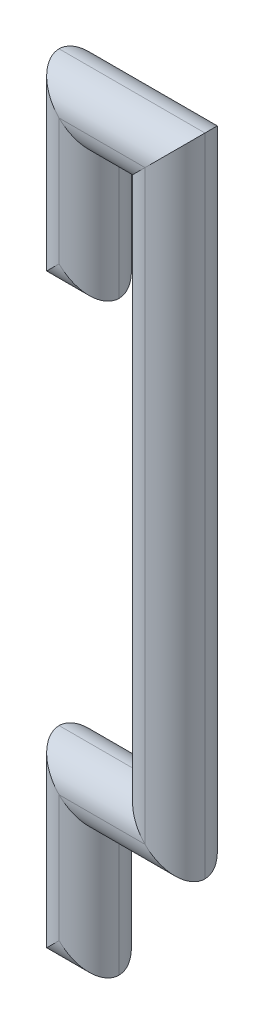
ISO-10303-21;
HEADER;
FILE_DESCRIPTION(('STEP AP214'),'2;1');
FILE_NAME('part.step','',(''),(''),'','','');
FILE_SCHEMA(('AUTOMOTIVE_DESIGN { 1 0 10303 214 1 1 1 1 }'));
ENDSEC;
DATA;
#1=APPLICATION_CONTEXT('core data for automotive mechanical design processes');
#2=APPLICATION_PROTOCOL_DEFINITION('international standard','automotive_design',2000,#1);
#3=PRODUCT_CONTEXT('',#1,'mechanical');
#4=PRODUCT('Part','Part','',(#3));
#5=PRODUCT_RELATED_PRODUCT_CATEGORY('part','',(#4));
#6=PRODUCT_DEFINITION_FORMATION('','',#4);
#7=PRODUCT_DEFINITION_CONTEXT('part definition',#1,'design');
#8=PRODUCT_DEFINITION('design','',#6,#7);
#9=PRODUCT_DEFINITION_SHAPE('','',#8);
#10=(LENGTH_UNIT() NAMED_UNIT(*) SI_UNIT(.MILLI.,.METRE.));
#11=(NAMED_UNIT(*) PLANE_ANGLE_UNIT() SI_UNIT($,.RADIAN.));
#12=(NAMED_UNIT(*) SI_UNIT($,.STERADIAN.) SOLID_ANGLE_UNIT());
#13=UNCERTAINTY_MEASURE_WITH_UNIT(LENGTH_MEASURE(1.E-05),#10,'distance_accuracy_value','');
#14=(GEOMETRIC_REPRESENTATION_CONTEXT(3) GLOBAL_UNCERTAINTY_ASSIGNED_CONTEXT((#13)) GLOBAL_UNIT_ASSIGNED_CONTEXT((#10,
#11,#12)) REPRESENTATION_CONTEXT('',''));
#15=CARTESIAN_POINT('',(0.,0.,0.));
#16=DIRECTION('',(0.,0.,1.));
#17=DIRECTION('',(1.,0.,0.));
#18=AXIS2_PLACEMENT_3D('',#15,#16,#17);
#19=CARTESIAN_POINT('',(-4.3,-9.7,0.));
#20=DIRECTION('',(-1.,0.,0.));
#21=DIRECTION('',(0.,-1.,0.));
#22=AXIS2_PLACEMENT_3D('',#19,#20,#21);
#23=CYLINDRICAL_SURFACE('',#22,2.3);
#24=CARTESIAN_POINT('',(-6.6,-9.7,0.));
#25=DIRECTION('',(-0.707106781186548,0.707106781186547,0.));
#26=DIRECTION('',(0.707106781186547,0.707106781186548,0.));
#27=AXIS2_PLACEMENT_3D('',#24,#25,#26);
#28=ELLIPSE('',#27,3.25269119345812,2.3);
#29=CARTESIAN_POINT('',(-8.9,-12.,0.));
#30=VERTEX_POINT('',#29);
#31=CARTESIAN_POINT('',(-6.6,-9.7,2.3));
#32=VERTEX_POINT('',#31);
#33=EDGE_CURVE('E11',#30,#32,#28,.T.);
#34=ORIENTED_EDGE('',*,*,#33,.F.);
#35=DIRECTION('',(-1.,0.,0.));
#36=VECTOR('',#35,1.);
#37=CARTESIAN_POINT('',(-4.3,-12.,0.));
#38=LINE('',#37,#36);
#39=CARTESIAN_POINT('',(-4.3,-12.,0.));
#40=VERTEX_POINT('',#39);
#41=EDGE_CURVE('E40',#40,#30,#38,.T.);
#42=ORIENTED_EDGE('',*,*,#41,.F.);
#43=CARTESIAN_POINT('',(-6.6,-9.7,0.));
#44=DIRECTION('',(-0.707106781186547,-0.707106781186548,0.));
#45=DIRECTION('',(-0.707106781186548,0.707106781186547,0.));
#46=AXIS2_PLACEMENT_3D('',#43,#44,#45);
#47=ELLIPSE('',#46,3.25269119345812,2.3);
#48=EDGE_CURVE('E250',#32,#40,#47,.F.);
#49=ORIENTED_EDGE('',*,*,#48,.F.);
#50=EDGE_LOOP('',(#34,#42,#49));
#51=FACE_BOUND('',#50,.T.);
#52=ADVANCED_FACE('F33',(#51),#23,.T.);
#53=CARTESIAN_POINT('',(-6.6,0.,0.));
#54=DIRECTION('',(0.,1.,0.));
#55=DIRECTION('',(-1.,0.,0.));
#56=AXIS2_PLACEMENT_3D('',#53,#54,#55);
#57=CYLINDRICAL_SURFACE('',#56,2.3);
#58=DIRECTION('',(0.,1.,0.));
#59=VECTOR('',#58,1.);
#60=CARTESIAN_POINT('',(-8.9,0.,0.));
#61=LINE('',#60,#59);
#62=CARTESIAN_POINT('',(-8.9,2.3,0.));
#63=VERTEX_POINT('',#62);
#64=EDGE_CURVE('E241',#30,#63,#61,.T.);
#65=ORIENTED_EDGE('',*,*,#64,.F.);
#66=ORIENTED_EDGE('',*,*,#33,.T.);
#67=DIRECTION('',(0.,1.,0.));
#68=VECTOR('',#67,1.);
#69=CARTESIAN_POINT('',(-6.6,0.,2.3));
#70=LINE('',#69,#68);
#71=CARTESIAN_POINT('',(-6.6,0.,2.3));
#72=VERTEX_POINT('',#71);
#73=EDGE_CURVE('E247',#72,#32,#70,.F.);
#74=ORIENTED_EDGE('',*,*,#73,.F.);
#75=CARTESIAN_POINT('',(-6.6,0.,0.));
#76=DIRECTION('',(0.707106781186547,0.707106781186548,0.));
#77=DIRECTION('',(0.707106781186548,-0.707106781186547,0.));
#78=AXIS2_PLACEMENT_3D('',#75,#76,#77);
#79=ELLIPSE('',#78,3.25269119345812,2.3);
#80=EDGE_CURVE('E244',#63,#72,#79,.T.);
#81=ORIENTED_EDGE('',*,*,#80,.F.);
#82=EDGE_LOOP('',(#65,#66,#74,#81));
#83=FACE_BOUND('',#82,.T.);
#84=ADVANCED_FACE('F256',(#83),#57,.T.);
#85=CARTESIAN_POINT('',(0.,-9.7,0.));
#86=DIRECTION('',(1.,0.,0.));
#87=DIRECTION('',(0.,1.,0.));
#88=AXIS2_PLACEMENT_3D('',#85,#86,#87);
#89=CYLINDRICAL_SURFACE('',#88,2.3);
#90=CARTESIAN_POINT('',(-6.6,-9.7,0.));
#91=DIRECTION('',(0.707106781186547,0.707106781186548,0.));
#92=DIRECTION('',(-0.707106781186548,0.707106781186547,0.));
#93=AXIS2_PLACEMENT_3D('',#90,#91,#92);
#94=ELLIPSE('',#93,3.25269119345812,2.3);
#95=CARTESIAN_POINT('',(-6.6,-9.7,-2.3));
#96=VERTEX_POINT('',#95);
#97=EDGE_CURVE('E233',#40,#96,#94,.T.);
#98=ORIENTED_EDGE('',*,*,#97,.F.);
#99=ORIENTED_EDGE('',*,*,#41,.T.);
#100=CARTESIAN_POINT('',(-6.6,-9.7,0.));
#101=DIRECTION('',(0.707106781186548,-0.707106781186547,0.));
#102=DIRECTION('',(0.707106781186547,0.707106781186548,0.));
#103=AXIS2_PLACEMENT_3D('',#100,#101,#102);
#104=ELLIPSE('',#103,3.25269119345812,2.3);
#105=EDGE_CURVE('E238',#96,#30,#104,.F.);
#106=ORIENTED_EDGE('',*,*,#105,.F.);
#107=EDGE_LOOP('',(#98,#99,#106));
#108=FACE_BOUND('',#107,.T.);
#109=ADVANCED_FACE('F254',(#108),#89,.T.);
#110=CARTESIAN_POINT('',(-6.6,0.,0.));
#111=DIRECTION('',(0.,-1.,0.));
#112=DIRECTION('',(1.,0.,0.));
#113=AXIS2_PLACEMENT_3D('',#110,#111,#112);
#114=CYLINDRICAL_SURFACE('',#113,2.3);
#115=ORIENTED_EDGE('',*,*,#73,.T.);
#116=ORIENTED_EDGE('',*,*,#48,.T.);
#117=DIRECTION('',(0.,1.,0.));
#118=VECTOR('',#117,1.);
#119=CARTESIAN_POINT('',(-4.3,-12.,0.));
#120=LINE('',#119,#118);
#121=CARTESIAN_POINT('',(-4.3,-2.3,0.));
#122=VERTEX_POINT('',#121);
#123=EDGE_CURVE('E230',#122,#40,#120,.F.);
#124=ORIENTED_EDGE('',*,*,#123,.F.);
#125=CARTESIAN_POINT('',(-6.6,0.,0.));
#126=DIRECTION('',(-0.707106781186547,-0.707106781186548,0.));
#127=DIRECTION('',(-0.707106781186548,0.707106781186547,0.));
#128=AXIS2_PLACEMENT_3D('',#125,#126,#127);
#129=ELLIPSE('',#128,3.25269119345812,2.3);
#130=EDGE_CURVE('E227',#72,#122,#129,.F.);
#131=ORIENTED_EDGE('',*,*,#130,.F.);
#132=EDGE_LOOP('',(#115,#116,#124,#131));
#133=FACE_BOUND('',#132,.T.);
#134=ADVANCED_FACE('F267',(#133),#114,.T.);
#135=CARTESIAN_POINT('',(0.,0.,0.));
#136=DIRECTION('',(1.,0.,0.));
#137=DIRECTION('',(0.,1.,0.));
#138=AXIS2_PLACEMENT_3D('',#135,#136,#137);
#139=CYLINDRICAL_SURFACE('',#138,2.3);
#140=DIRECTION('',(1.,0.,0.));
#141=VECTOR('',#140,1.);
#142=CARTESIAN_POINT('',(0.,2.3,0.));
#143=LINE('',#142,#141);
#144=CARTESIAN_POINT('',(2.3,2.3,0.));
#145=VERTEX_POINT('',#144);
#146=EDGE_CURVE('E218',#63,#145,#143,.T.);
#147=ORIENTED_EDGE('',*,*,#146,.F.);
#148=ORIENTED_EDGE('',*,*,#80,.T.);
#149=DIRECTION('',(1.,0.,0.));
#150=VECTOR('',#149,1.);
#151=CARTESIAN_POINT('',(0.,0.,2.3));
#152=LINE('',#151,#150);
#153=CARTESIAN_POINT('',(0.,0.,2.3));
#154=VERTEX_POINT('',#153);
#155=EDGE_CURVE('E224',#154,#72,#152,.F.);
#156=ORIENTED_EDGE('',*,*,#155,.F.);
#157=CARTESIAN_POINT('',(0.,0.,0.));
#158=DIRECTION('',(0.707106781186548,-0.707106781186547,0.));
#159=DIRECTION('',(-0.707106781186547,-0.707106781186548,0.));
#160=AXIS2_PLACEMENT_3D('',#157,#158,#159);
#161=ELLIPSE('',#160,3.25269119345812,2.3);
#162=EDGE_CURVE('E221',#145,#154,#161,.T.);
#163=ORIENTED_EDGE('',*,*,#162,.F.);
#164=EDGE_LOOP('',(#147,#148,#156,#163));
#165=FACE_BOUND('',#164,.T.);
#166=ADVANCED_FACE('F272',(#165),#139,.T.);
#167=CARTESIAN_POINT('',(-6.6,0.,0.));
#168=DIRECTION('',(0.,-1.,0.));
#169=DIRECTION('',(1.,0.,0.));
#170=AXIS2_PLACEMENT_3D('',#167,#168,#169);
#171=CYLINDRICAL_SURFACE('',#170,2.3);
#172=DIRECTION('',(0.,1.,0.));
#173=VECTOR('',#172,1.);
#174=CARTESIAN_POINT('',(-6.6,2.3,-2.3));
#175=LINE('',#174,#173);
#176=CARTESIAN_POINT('',(-6.6,0.,-2.3));
#177=VERTEX_POINT('',#176);
#178=EDGE_CURVE('E236',#96,#177,#175,.T.);
#179=ORIENTED_EDGE('',*,*,#178,.F.);
#180=ORIENTED_EDGE('',*,*,#105,.T.);
#181=ORIENTED_EDGE('',*,*,#64,.T.);
#182=CARTESIAN_POINT('',(-6.6,0.,0.));
#183=DIRECTION('',(-0.707106781186547,-0.707106781186548,0.));
#184=DIRECTION('',(0.707106781186548,-0.707106781186547,0.));
#185=AXIS2_PLACEMENT_3D('',#182,#183,#184);
#186=ELLIPSE('',#185,3.25269119345812,2.3);
#187=EDGE_CURVE('E215',#177,#63,#186,.F.);
#188=ORIENTED_EDGE('',*,*,#187,.F.);
#189=EDGE_LOOP('',(#179,#180,#181,#188));
#190=FACE_BOUND('',#189,.T.);
#191=ADVANCED_FACE('F260',(#190),#171,.T.);
#192=CARTESIAN_POINT('',(-6.6,0.,0.));
#193=DIRECTION('',(0.,1.,0.));
#194=DIRECTION('',(-1.,0.,0.));
#195=AXIS2_PLACEMENT_3D('',#192,#193,#194);
#196=CYLINDRICAL_SURFACE('',#195,2.3);
#197=ORIENTED_EDGE('',*,*,#97,.T.);
#198=ORIENTED_EDGE('',*,*,#178,.T.);
#199=CARTESIAN_POINT('',(-6.6,0.,0.));
#200=DIRECTION('',(0.707106781186547,0.707106781186548,0.));
#201=DIRECTION('',(-0.707106781186548,0.707106781186547,0.));
#202=AXIS2_PLACEMENT_3D('',#199,#200,#201);
#203=ELLIPSE('',#202,3.25269119345812,2.3);
#204=EDGE_CURVE('E210',#122,#177,#203,.T.);
#205=ORIENTED_EDGE('',*,*,#204,.F.);
#206=ORIENTED_EDGE('',*,*,#123,.T.);
#207=EDGE_LOOP('',(#197,#198,#205,#206));
#208=FACE_BOUND('',#207,.T.);
#209=ADVANCED_FACE('F264',(#208),#196,.T.);
#210=CARTESIAN_POINT('',(0.,0.,0.));
#211=DIRECTION('',(-1.,0.,0.));
#212=DIRECTION('',(0.,-1.,0.));
#213=AXIS2_PLACEMENT_3D('',#210,#211,#212);
#214=CYLINDRICAL_SURFACE('',#213,2.3);
#215=ORIENTED_EDGE('',*,*,#155,.T.);
#216=ORIENTED_EDGE('',*,*,#130,.T.);
#217=DIRECTION('',(1.,0.,0.));
#218=VECTOR('',#217,1.);
#219=CARTESIAN_POINT('',(-4.3,-2.3,0.));
#220=LINE('',#219,#218);
#221=CARTESIAN_POINT('',(-2.3,-2.3,0.));
#222=VERTEX_POINT('',#221);
#223=EDGE_CURVE('E207',#222,#122,#220,.F.);
#224=ORIENTED_EDGE('',*,*,#223,.F.);
#225=CARTESIAN_POINT('',(0.,0.,0.));
#226=DIRECTION('',(-0.707106781186548,0.707106781186547,0.));
#227=DIRECTION('',(0.707106781186547,0.707106781186548,0.));
#228=AXIS2_PLACEMENT_3D('',#225,#226,#227);
#229=ELLIPSE('',#228,3.25269119345812,2.3);
#230=EDGE_CURVE('E204',#154,#222,#229,.F.);
#231=ORIENTED_EDGE('',*,*,#230,.F.);
#232=EDGE_LOOP('',(#215,#216,#224,#231));
#233=FACE_BOUND('',#232,.T.);
#234=ADVANCED_FACE('F269',(#233),#214,.T.);
#235=CARTESIAN_POINT('',(0.,0.,0.));
#236=DIRECTION('',(0.,-1.,0.));
#237=DIRECTION('',(0.,0.,-1.));
#238=AXIS2_PLACEMENT_3D('',#235,#236,#237);
#239=CYLINDRICAL_SURFACE('',#238,2.3);
#240=DIRECTION('',(0.,-1.,0.));
#241=VECTOR('',#240,1.);
#242=CARTESIAN_POINT('',(2.3,0.,0.));
#243=LINE('',#242,#241);
#244=CARTESIAN_POINT('',(2.3,-47.3,0.));
#245=VERTEX_POINT('',#244);
#246=EDGE_CURVE('E195',#145,#245,#243,.T.);
#247=ORIENTED_EDGE('',*,*,#246,.F.);
#248=ORIENTED_EDGE('',*,*,#162,.T.);
#249=DIRECTION('',(0.,-1.,0.));
#250=VECTOR('',#249,1.);
#251=CARTESIAN_POINT('',(0.,0.,2.3));
#252=LINE('',#251,#250);
#253=CARTESIAN_POINT('',(0.,-45.,2.3));
#254=VERTEX_POINT('',#253);
#255=EDGE_CURVE('E201',#254,#154,#252,.F.);
#256=ORIENTED_EDGE('',*,*,#255,.F.);
#257=CARTESIAN_POINT('',(0.,-45.,0.));
#258=DIRECTION('',(-0.707106781186547,-0.707106781186547,0.));
#259=DIRECTION('',(-0.707106781186547,0.707106781186547,0.));
#260=AXIS2_PLACEMENT_3D('',#257,#258,#259);
#261=ELLIPSE('',#260,3.25269119345812,2.3);
#262=EDGE_CURVE('E198',#245,#254,#261,.T.);
#263=ORIENTED_EDGE('',*,*,#262,.F.);
#264=EDGE_LOOP('',(#247,#248,#256,#263));
#265=FACE_BOUND('',#264,.T.);
#266=ADVANCED_FACE('F275',(#265),#239,.T.);
#267=CARTESIAN_POINT('',(0.,0.,0.));
#268=DIRECTION('',(-1.,0.,0.));
#269=DIRECTION('',(0.,-1.,0.));
#270=AXIS2_PLACEMENT_3D('',#267,#268,#269);
#271=CYLINDRICAL_SURFACE('',#270,2.3);
#272=DIRECTION('',(1.,0.,0.));
#273=VECTOR('',#272,1.);
#274=CARTESIAN_POINT('',(2.3,0.,-2.3));
#275=LINE('',#274,#273);
#276=CARTESIAN_POINT('',(0.,0.,-2.3));
#277=VERTEX_POINT('',#276);
#278=EDGE_CURVE('E213',#177,#277,#275,.T.);
#279=ORIENTED_EDGE('',*,*,#278,.F.);
#280=ORIENTED_EDGE('',*,*,#187,.T.);
#281=ORIENTED_EDGE('',*,*,#146,.T.);
#282=CARTESIAN_POINT('',(0.,0.,0.));
#283=DIRECTION('',(-0.707106781186548,0.707106781186547,0.));
#284=DIRECTION('',(-0.707106781186547,-0.707106781186548,0.));
#285=AXIS2_PLACEMENT_3D('',#282,#283,#284);
#286=ELLIPSE('',#285,3.25269119345812,2.3);
#287=EDGE_CURVE('E192',#277,#145,#286,.F.);
#288=ORIENTED_EDGE('',*,*,#287,.F.);
#289=EDGE_LOOP('',(#279,#280,#281,#288));
#290=FACE_BOUND('',#289,.T.);
#291=ADVANCED_FACE('F283',(#290),#271,.T.);
#292=CARTESIAN_POINT('',(0.,0.,0.));
#293=DIRECTION('',(1.,0.,0.));
#294=DIRECTION('',(0.,1.,0.));
#295=AXIS2_PLACEMENT_3D('',#292,#293,#294);
#296=CYLINDRICAL_SURFACE('',#295,2.3);
#297=ORIENTED_EDGE('',*,*,#204,.T.);
#298=ORIENTED_EDGE('',*,*,#278,.T.);
#299=CARTESIAN_POINT('',(0.,0.,0.));
#300=DIRECTION('',(0.707106781186548,-0.707106781186547,0.));
#301=DIRECTION('',(0.707106781186547,0.707106781186548,0.));
#302=AXIS2_PLACEMENT_3D('',#299,#300,#301);
#303=ELLIPSE('',#302,3.25269119345812,2.3);
#304=EDGE_CURVE('E187',#222,#277,#303,.T.);
#305=ORIENTED_EDGE('',*,*,#304,.F.);
#306=ORIENTED_EDGE('',*,*,#223,.T.);
#307=EDGE_LOOP('',(#297,#298,#305,#306));
#308=FACE_BOUND('',#307,.T.);
#309=ADVANCED_FACE('F286',(#308),#296,.T.);
#310=CARTESIAN_POINT('',(0.,0.,0.));
#311=DIRECTION('',(0.,1.,0.));
#312=DIRECTION('',(0.,0.,1.));
#313=AXIS2_PLACEMENT_3D('',#310,#311,#312);
#314=CYLINDRICAL_SURFACE('',#313,2.3);
#315=ORIENTED_EDGE('',*,*,#255,.T.);
#316=ORIENTED_EDGE('',*,*,#230,.T.);
#317=DIRECTION('',(0.,-1.,0.));
#318=VECTOR('',#317,1.);
#319=CARTESIAN_POINT('',(-2.3,-2.3,0.));
#320=LINE('',#319,#318);
#321=CARTESIAN_POINT('',(-2.3,-42.7,0.));
#322=VERTEX_POINT('',#321);
#323=EDGE_CURVE('E184',#322,#222,#320,.F.);
#324=ORIENTED_EDGE('',*,*,#323,.F.);
#325=CARTESIAN_POINT('',(0.,-45.,0.));
#326=DIRECTION('',(0.707106781186547,0.707106781186547,0.));
#327=DIRECTION('',(0.707106781186547,-0.707106781186547,0.));
#328=AXIS2_PLACEMENT_3D('',#325,#326,#327);
#329=ELLIPSE('',#328,3.25269119345812,2.3);
#330=EDGE_CURVE('E181',#254,#322,#329,.F.);
#331=ORIENTED_EDGE('',*,*,#330,.F.);
#332=EDGE_LOOP('',(#315,#316,#324,#331));
#333=FACE_BOUND('',#332,.T.);
#334=ADVANCED_FACE('F292',(#333),#314,.T.);
#335=CARTESIAN_POINT('',(0.,-45.,0.));
#336=DIRECTION('',(-1.,0.,0.));
#337=DIRECTION('',(0.,0.,1.));
#338=AXIS2_PLACEMENT_3D('',#335,#336,#337);
#339=CYLINDRICAL_SURFACE('',#338,2.3);
#340=DIRECTION('',(-1.,0.,0.));
#341=VECTOR('',#340,1.);
#342=CARTESIAN_POINT('',(0.,-47.3,0.));
#343=LINE('',#342,#341);
#344=CARTESIAN_POINT('',(-4.29999999999999,-47.3,0.));
#345=VERTEX_POINT('',#344);
#346=EDGE_CURVE('E172',#245,#345,#343,.T.);
#347=ORIENTED_EDGE('',*,*,#346,.F.);
#348=ORIENTED_EDGE('',*,*,#262,.T.);
#349=DIRECTION('',(-1.,0.,0.));
#350=VECTOR('',#349,1.);
#351=CARTESIAN_POINT('',(0.,-45.,2.3));
#352=LINE('',#351,#350);
#353=CARTESIAN_POINT('',(-6.59999999999999,-45.,2.3));
#354=VERTEX_POINT('',#353);
#355=EDGE_CURVE('E178',#354,#254,#352,.F.);
#356=ORIENTED_EDGE('',*,*,#355,.F.);
#357=CARTESIAN_POINT('',(-6.59999999999999,-45.,0.));
#358=DIRECTION('',(-0.707106781186547,-0.707106781186547,0.));
#359=DIRECTION('',(-0.707106781186547,0.707106781186547,0.));
#360=AXIS2_PLACEMENT_3D('',#357,#358,#359);
#361=ELLIPSE('',#360,3.25269119345812,2.3);
#362=EDGE_CURVE('E175',#345,#354,#361,.T.);
#363=ORIENTED_EDGE('',*,*,#362,.F.);
#364=EDGE_LOOP('',(#347,#348,#356,#363));
#365=FACE_BOUND('',#364,.T.);
#366=ADVANCED_FACE('F297',(#365),#339,.T.);
#367=CARTESIAN_POINT('',(0.,0.,0.));
#368=DIRECTION('',(0.,1.,0.));
#369=DIRECTION('',(0.,0.,1.));
#370=AXIS2_PLACEMENT_3D('',#367,#368,#369);
#371=CYLINDRICAL_SURFACE('',#370,2.3);
#372=DIRECTION('',(0.,-1.,0.));
#373=VECTOR('',#372,1.);
#374=CARTESIAN_POINT('',(0.,-47.3,-2.3));
#375=LINE('',#374,#373);
#376=CARTESIAN_POINT('',(0.,-45.,-2.3));
#377=VERTEX_POINT('',#376);
#378=EDGE_CURVE('E190',#277,#377,#375,.T.);
#379=ORIENTED_EDGE('',*,*,#378,.F.);
#380=ORIENTED_EDGE('',*,*,#287,.T.);
#381=ORIENTED_EDGE('',*,*,#246,.T.);
#382=CARTESIAN_POINT('',(0.,-45.,0.));
#383=DIRECTION('',(0.707106781186547,0.707106781186547,0.));
#384=DIRECTION('',(-0.707106781186547,0.707106781186547,0.));
#385=AXIS2_PLACEMENT_3D('',#382,#383,#384);
#386=ELLIPSE('',#385,3.25269119345812,2.3);
#387=EDGE_CURVE('E169',#377,#245,#386,.F.);
#388=ORIENTED_EDGE('',*,*,#387,.F.);
#389=EDGE_LOOP('',(#379,#380,#381,#388));
#390=FACE_BOUND('',#389,.T.);
#391=ADVANCED_FACE('F281',(#390),#371,.T.);
#392=CARTESIAN_POINT('',(0.,0.,0.));
#393=DIRECTION('',(0.,-1.,0.));
#394=DIRECTION('',(0.,0.,-1.));
#395=AXIS2_PLACEMENT_3D('',#392,#393,#394);
#396=CYLINDRICAL_SURFACE('',#395,2.3);
#397=ORIENTED_EDGE('',*,*,#304,.T.);
#398=ORIENTED_EDGE('',*,*,#378,.T.);
#399=CARTESIAN_POINT('',(0.,-45.,0.));
#400=DIRECTION('',(-0.707106781186547,-0.707106781186547,0.));
#401=DIRECTION('',(0.707106781186547,-0.707106781186547,0.));
#402=AXIS2_PLACEMENT_3D('',#399,#400,#401);
#403=ELLIPSE('',#402,3.25269119345812,2.3);
#404=EDGE_CURVE('E164',#322,#377,#403,.T.);
#405=ORIENTED_EDGE('',*,*,#404,.F.);
#406=ORIENTED_EDGE('',*,*,#323,.T.);
#407=EDGE_LOOP('',(#397,#398,#405,#406));
#408=FACE_BOUND('',#407,.T.);
#409=ADVANCED_FACE('F289',(#408),#396,.T.);
#410=CARTESIAN_POINT('',(0.,-45.,0.));
#411=DIRECTION('',(1.,0.,0.));
#412=DIRECTION('',(0.,0.,-1.));
#413=AXIS2_PLACEMENT_3D('',#410,#411,#412);
#414=CYLINDRICAL_SURFACE('',#413,2.3);
#415=ORIENTED_EDGE('',*,*,#355,.T.);
#416=ORIENTED_EDGE('',*,*,#330,.T.);
#417=DIRECTION('',(-1.,0.,0.));
#418=VECTOR('',#417,1.);
#419=CARTESIAN_POINT('',(-2.3,-42.7,0.));
#420=LINE('',#419,#418);
#421=CARTESIAN_POINT('',(-8.89999999999999,-42.7,0.));
#422=VERTEX_POINT('',#421);
#423=EDGE_CURVE('E161',#422,#322,#420,.F.);
#424=ORIENTED_EDGE('',*,*,#423,.F.);
#425=CARTESIAN_POINT('',(-6.59999999999999,-45.,0.));
#426=DIRECTION('',(0.707106781186547,0.707106781186547,0.));
#427=DIRECTION('',(-0.707106781186547,0.707106781186547,0.));
#428=AXIS2_PLACEMENT_3D('',#425,#426,#427);
#429=ELLIPSE('',#428,3.25269119345812,2.3);
#430=EDGE_CURVE('E158',#354,#422,#429,.F.);
#431=ORIENTED_EDGE('',*,*,#430,.F.);
#432=EDGE_LOOP('',(#415,#416,#424,#431));
#433=FACE_BOUND('',#432,.T.);
#434=ADVANCED_FACE('F294',(#433),#414,.T.);
#435=CARTESIAN_POINT('',(-6.59999999999999,-45.,0.));
#436=DIRECTION('',(0.,-1.,0.));
#437=DIRECTION('',(0.,0.,-1.));
#438=AXIS2_PLACEMENT_3D('',#435,#436,#437);
#439=CYLINDRICAL_SURFACE('',#438,2.3);
#440=DIRECTION('',(0.,-1.,0.));
#441=VECTOR('',#440,1.);
#442=CARTESIAN_POINT('',(-4.29999999999999,-45.,0.));
#443=LINE('',#442,#441);
#444=CARTESIAN_POINT('',(-4.29999999999999,-57.,0.));
#445=VERTEX_POINT('',#444);
#446=EDGE_CURVE('E135',#345,#445,#443,.T.);
#447=ORIENTED_EDGE('',*,*,#446,.F.);
#448=ORIENTED_EDGE('',*,*,#362,.T.);
#449=DIRECTION('',(0.,-1.,0.));
#450=VECTOR('',#449,1.);
#451=CARTESIAN_POINT('',(-6.59999999999999,0.,2.3));
#452=LINE('',#451,#450);
#453=CARTESIAN_POINT('',(-6.59999999999999,-54.7,2.3));
#454=VERTEX_POINT('',#453);
#455=EDGE_CURVE('E155',#454,#354,#452,.F.);
#456=ORIENTED_EDGE('',*,*,#455,.F.);
#457=CARTESIAN_POINT('',(-6.59999999999999,-54.7,0.));
#458=DIRECTION('',(-0.707106781186547,-0.707106781186547,0.));
#459=DIRECTION('',(-0.707106781186547,0.707106781186547,0.));
#460=AXIS2_PLACEMENT_3D('',#457,#458,#459);
#461=ELLIPSE('',#460,3.25269119345812,2.3);
#462=EDGE_CURVE('E150',#445,#454,#461,.T.);
#463=ORIENTED_EDGE('',*,*,#462,.F.);
#464=EDGE_LOOP('',(#447,#448,#456,#463));
#465=FACE_BOUND('',#464,.T.);
#466=ADVANCED_FACE('F299',(#465),#439,.T.);
#467=CARTESIAN_POINT('',(0.,-45.,0.));
#468=DIRECTION('',(1.,0.,0.));
#469=DIRECTION('',(0.,0.,-1.));
#470=AXIS2_PLACEMENT_3D('',#467,#468,#469);
#471=CYLINDRICAL_SURFACE('',#470,2.3);
#472=DIRECTION('',(-1.,0.,0.));
#473=VECTOR('',#472,1.);
#474=CARTESIAN_POINT('',(-4.29999999999999,-45.,-2.3));
#475=LINE('',#474,#473);
#476=CARTESIAN_POINT('',(-6.59999999999999,-45.,-2.3));
#477=VERTEX_POINT('',#476);
#478=EDGE_CURVE('E167',#377,#477,#475,.T.);
#479=ORIENTED_EDGE('',*,*,#478,.F.);
#480=ORIENTED_EDGE('',*,*,#387,.T.);
#481=ORIENTED_EDGE('',*,*,#346,.T.);
#482=CARTESIAN_POINT('',(-6.59999999999999,-45.,0.));
#483=DIRECTION('',(0.707106781186547,0.707106781186547,0.));
#484=DIRECTION('',(-0.707106781186547,0.707106781186547,0.));
#485=AXIS2_PLACEMENT_3D('',#482,#483,#484);
#486=ELLIPSE('',#485,3.25269119345812,2.3);
#487=EDGE_CURVE('E128',#477,#345,#486,.F.);
#488=ORIENTED_EDGE('',*,*,#487,.F.);
#489=EDGE_LOOP('',(#479,#480,#481,#488));
#490=FACE_BOUND('',#489,.T.);
#491=ADVANCED_FACE('F304',(#490),#471,.T.);
#492=CARTESIAN_POINT('',(0.,-45.,0.));
#493=DIRECTION('',(-1.,0.,0.));
#494=DIRECTION('',(0.,0.,1.));
#495=AXIS2_PLACEMENT_3D('',#492,#493,#494);
#496=CYLINDRICAL_SURFACE('',#495,2.3);
#497=ORIENTED_EDGE('',*,*,#404,.T.);
#498=ORIENTED_EDGE('',*,*,#478,.T.);
#499=CARTESIAN_POINT('',(-6.59999999999999,-45.,0.));
#500=DIRECTION('',(-0.707106781186547,-0.707106781186547,0.));
#501=DIRECTION('',(0.707106781186547,-0.707106781186547,0.));
#502=AXIS2_PLACEMENT_3D('',#499,#500,#501);
#503=ELLIPSE('',#502,3.25269119345812,2.3);
#504=EDGE_CURVE('E125',#422,#477,#503,.T.);
#505=ORIENTED_EDGE('',*,*,#504,.F.);
#506=ORIENTED_EDGE('',*,*,#423,.T.);
#507=EDGE_LOOP('',(#497,#498,#505,#506));
#508=FACE_BOUND('',#507,.T.);
#509=ADVANCED_FACE('F306',(#508),#496,.T.);
#510=CARTESIAN_POINT('',(-6.59999999999999,0.,0.));
#511=DIRECTION('',(0.,1.,0.));
#512=DIRECTION('',(0.,0.,1.));
#513=AXIS2_PLACEMENT_3D('',#510,#511,#512);
#514=CYLINDRICAL_SURFACE('',#513,2.3);
#515=CARTESIAN_POINT('',(-6.59999999999999,-54.7,0.));
#516=DIRECTION('',(-0.707106781186547,0.707106781186547,0.));
#517=DIRECTION('',(0.707106781186547,0.707106781186547,0.));
#518=AXIS2_PLACEMENT_3D('',#515,#516,#517);
#519=ELLIPSE('',#518,3.25269119345812,2.3);
#520=CARTESIAN_POINT('',(-8.89999999999999,-57.,0.));
#521=VERTEX_POINT('',#520);
#522=EDGE_CURVE('E153',#454,#521,#519,.F.);
#523=ORIENTED_EDGE('',*,*,#522,.F.);
#524=ORIENTED_EDGE('',*,*,#455,.T.);
#525=ORIENTED_EDGE('',*,*,#430,.T.);
#526=DIRECTION('',(0.,-1.,0.));
#527=VECTOR('',#526,1.);
#528=CARTESIAN_POINT('',(-8.89999999999999,-42.7,0.));
#529=LINE('',#528,#527);
#530=EDGE_CURVE('E145',#521,#422,#529,.F.);
#531=ORIENTED_EDGE('',*,*,#530,.F.);
#532=EDGE_LOOP('',(#523,#524,#525,#531));
#533=FACE_BOUND('',#532,.T.);
#534=ADVANCED_FACE('F309',(#533),#514,.T.);
#535=CARTESIAN_POINT('',(-4.29999999999999,-54.7,0.));
#536=DIRECTION('',(-1.,0.,0.));
#537=DIRECTION('',(0.,0.,1.));
#538=AXIS2_PLACEMENT_3D('',#535,#536,#537);
#539=CYLINDRICAL_SURFACE('',#538,2.3);
#540=ORIENTED_EDGE('',*,*,#462,.T.);
#541=ORIENTED_EDGE('',*,*,#522,.T.);
#542=DIRECTION('',(-1.,0.,0.));
#543=VECTOR('',#542,1.);
#544=CARTESIAN_POINT('',(-4.29999999999999,-57.,0.));
#545=LINE('',#544,#543);
#546=EDGE_CURVE('E139',#445,#521,#545,.T.);
#547=ORIENTED_EDGE('',*,*,#546,.F.);
#548=EDGE_LOOP('',(#540,#541,#547));
#549=FACE_BOUND('',#548,.T.);
#550=ADVANCED_FACE('F311',(#549),#539,.T.);
#551=CARTESIAN_POINT('',(-6.59999999999999,0.,0.));
#552=DIRECTION('',(0.,1.,0.));
#553=DIRECTION('',(0.,0.,1.));
#554=AXIS2_PLACEMENT_3D('',#551,#552,#553);
#555=CYLINDRICAL_SURFACE('',#554,2.3);
#556=DIRECTION('',(0.,-1.,0.));
#557=VECTOR('',#556,1.);
#558=CARTESIAN_POINT('',(-6.59999999999999,-57.,-2.3));
#559=LINE('',#558,#557);
#560=CARTESIAN_POINT('',(-6.59999999999999,-54.7,-2.3));
#561=VERTEX_POINT('',#560);
#562=EDGE_CURVE('E118',#477,#561,#559,.T.);
#563=ORIENTED_EDGE('',*,*,#562,.F.);
#564=ORIENTED_EDGE('',*,*,#487,.T.);
#565=ORIENTED_EDGE('',*,*,#446,.T.);
#566=CARTESIAN_POINT('',(-6.59999999999999,-54.7,0.));
#567=DIRECTION('',(0.707106781186547,0.707106781186547,0.));
#568=DIRECTION('',(-0.707106781186547,0.707106781186547,0.));
#569=AXIS2_PLACEMENT_3D('',#566,#567,#568);
#570=ELLIPSE('',#569,3.25269119345812,2.3);
#571=EDGE_CURVE('E132',#561,#445,#570,.F.);
#572=ORIENTED_EDGE('',*,*,#571,.F.);
#573=EDGE_LOOP('',(#563,#564,#565,#572));
#574=FACE_BOUND('',#573,.T.);
#575=ADVANCED_FACE('F133',(#574),#555,.T.);
#576=CARTESIAN_POINT('',(-6.59999999999999,-45.,0.));
#577=DIRECTION('',(0.,-1.,0.));
#578=DIRECTION('',(0.,0.,-1.));
#579=AXIS2_PLACEMENT_3D('',#576,#577,#578);
#580=CYLINDRICAL_SURFACE('',#579,2.3);
#581=ORIENTED_EDGE('',*,*,#504,.T.);
#582=ORIENTED_EDGE('',*,*,#562,.T.);
#583=CARTESIAN_POINT('',(-6.59999999999999,-54.7,0.));
#584=DIRECTION('',(0.707106781186547,-0.707106781186547,0.));
#585=DIRECTION('',(-0.707106781186547,-0.707106781186547,0.));
#586=AXIS2_PLACEMENT_3D('',#583,#584,#585);
#587=ELLIPSE('',#586,3.25269119345812,2.3);
#588=EDGE_CURVE('E123',#521,#561,#587,.T.);
#589=ORIENTED_EDGE('',*,*,#588,.F.);
#590=ORIENTED_EDGE('',*,*,#530,.T.);
#591=EDGE_LOOP('',(#581,#582,#589,#590));
#592=FACE_BOUND('',#591,.T.);
#593=ADVANCED_FACE('F120',(#592),#580,.T.);
#594=CARTESIAN_POINT('',(0.,-54.7,0.));
#595=DIRECTION('',(1.,0.,0.));
#596=DIRECTION('',(0.,0.,-1.));
#597=AXIS2_PLACEMENT_3D('',#594,#595,#596);
#598=CYLINDRICAL_SURFACE('',#597,2.3);
#599=ORIENTED_EDGE('',*,*,#571,.T.);
#600=ORIENTED_EDGE('',*,*,#546,.T.);
#601=ORIENTED_EDGE('',*,*,#588,.T.);
#602=EDGE_LOOP('',(#599,#600,#601));
#603=FACE_BOUND('',#602,.T.);
#604=ADVANCED_FACE('F141',(#603),#598,.T.);
#605=CLOSED_SHELL('',(#52,#84,#109,#134,#166,#191,#209,#234,#266,#291,#309,#334,#366,#391,#409,
#434,#466,#491,#509,#534,#550,#575,#593,#604));
#606=MANIFOLD_SOLID_BREP('B2',#605);
#607=ADVANCED_BREP_SHAPE_REPRESENTATION('',(#18,#606),#14);
#608=SHAPE_DEFINITION_REPRESENTATION(#9,#607);
ENDSEC;
END-ISO-10303-21;
